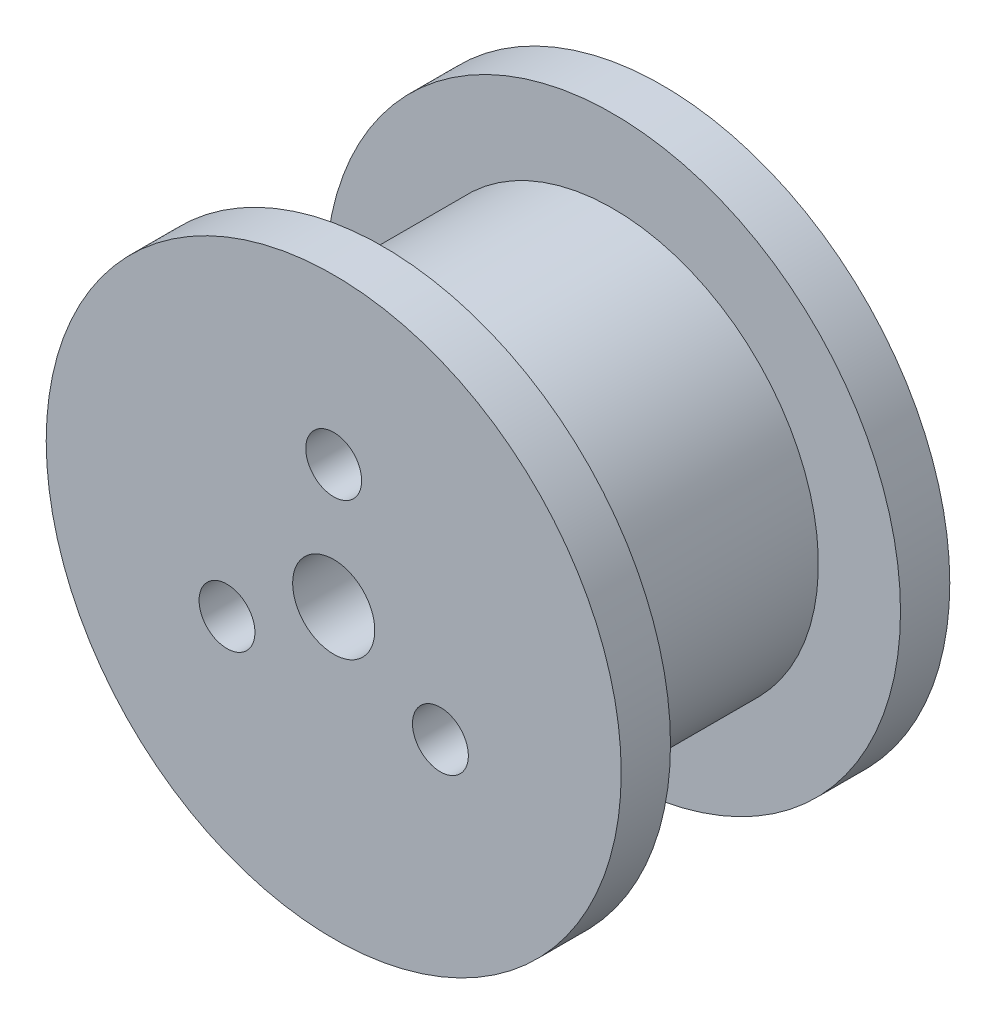
ISO-10303-21;
HEADER;
FILE_DESCRIPTION(('STEP AP214'),'2;1');
FILE_NAME('part.step','',(''),(''),'','','');
FILE_SCHEMA(('AUTOMOTIVE_DESIGN { 1 0 10303 214 1 1 1 1 }'));
ENDSEC;
DATA;
#1=APPLICATION_CONTEXT('core data for automotive mechanical design processes');
#2=APPLICATION_PROTOCOL_DEFINITION('international standard','automotive_design',2000,#1);
#3=PRODUCT_CONTEXT('',#1,'mechanical');
#4=PRODUCT('Part','Part','',(#3));
#5=PRODUCT_RELATED_PRODUCT_CATEGORY('part','',(#4));
#6=PRODUCT_DEFINITION_FORMATION('','',#4);
#7=PRODUCT_DEFINITION_CONTEXT('part definition',#1,'design');
#8=PRODUCT_DEFINITION('design','',#6,#7);
#9=PRODUCT_DEFINITION_SHAPE('','',#8);
#10=(LENGTH_UNIT() NAMED_UNIT(*) SI_UNIT(.MILLI.,.METRE.));
#11=(NAMED_UNIT(*) PLANE_ANGLE_UNIT() SI_UNIT($,.RADIAN.));
#12=(NAMED_UNIT(*) SI_UNIT($,.STERADIAN.) SOLID_ANGLE_UNIT());
#13=UNCERTAINTY_MEASURE_WITH_UNIT(LENGTH_MEASURE(1.E-05),#10,'distance_accuracy_value','');
#14=(GEOMETRIC_REPRESENTATION_CONTEXT(3) GLOBAL_UNCERTAINTY_ASSIGNED_CONTEXT((#13)) GLOBAL_UNIT_ASSIGNED_CONTEXT((#10,
#11,#12)) REPRESENTATION_CONTEXT('',''));
#15=CARTESIAN_POINT('',(0.,0.,0.));
#16=DIRECTION('',(0.,0.,1.));
#17=DIRECTION('',(1.,0.,0.));
#18=AXIS2_PLACEMENT_3D('',#15,#16,#17);
#19=CARTESIAN_POINT('',(0.,0.,20.));
#20=DIRECTION('',(0.,0.,1.));
#21=DIRECTION('',(1.,0.,0.));
#22=AXIS2_PLACEMENT_3D('',#19,#20,#21);
#23=PLANE('',#22);
#24=CARTESIAN_POINT('',(0.,0.,20.));
#25=DIRECTION('',(0.,0.,1.));
#26=DIRECTION('',(1.,0.,0.));
#27=AXIS2_PLACEMENT_3D('',#24,#25,#26);
#28=CIRCLE('',#27,17.5);
#29=CARTESIAN_POINT('',(17.5,0.,20.));
#30=VERTEX_POINT('',#29);
#31=EDGE_CURVE('E10',#30,#30,#28,.T.);
#32=ORIENTED_EDGE('',*,*,#31,.T.);
#33=EDGE_LOOP('',(#32));
#34=FACE_BOUND('',#33,.T.);
#35=CARTESIAN_POINT('',(0.,0.,20.));
#36=DIRECTION('',(0.,0.,-1.));
#37=DIRECTION('',(-1.,0.,0.));
#38=AXIS2_PLACEMENT_3D('',#35,#36,#37);
#39=CIRCLE('',#38,2.5);
#40=CARTESIAN_POINT('',(-2.5,0.,20.));
#41=VERTEX_POINT('',#40);
#42=EDGE_CURVE('E54',#41,#41,#39,.T.);
#43=ORIENTED_EDGE('',*,*,#42,.T.);
#44=EDGE_LOOP('',(#43));
#45=FACE_BOUND('',#44,.T.);
#46=CARTESIAN_POINT('',(6.49519052838281,-3.75000000000027,20.));
#47=DIRECTION('',(0.,0.,-1.));
#48=DIRECTION('',(-1.,0.,0.));
#49=AXIS2_PLACEMENT_3D('',#46,#47,#48);
#50=CIRCLE('',#49,1.7);
#51=CARTESIAN_POINT('',(4.79519052838282,-3.75000000000027,20.));
#52=VERTEX_POINT('',#51);
#53=EDGE_CURVE('E58',#52,#52,#50,.T.);
#54=ORIENTED_EDGE('',*,*,#53,.T.);
#55=EDGE_LOOP('',(#54));
#56=FACE_BOUND('',#55,.T.);
#57=CARTESIAN_POINT('',(-6.49519052838377,-3.74999999999972,20.));
#58=DIRECTION('',(0.,0.,-1.));
#59=DIRECTION('',(-1.,0.,0.));
#60=AXIS2_PLACEMENT_3D('',#57,#58,#59);
#61=CIRCLE('',#60,1.69999999999999);
#62=CARTESIAN_POINT('',(-8.19519052838376,-3.74999999999972,20.));
#63=VERTEX_POINT('',#62);
#64=EDGE_CURVE('E66',#63,#63,#61,.T.);
#65=ORIENTED_EDGE('',*,*,#64,.T.);
#66=EDGE_LOOP('',(#65));
#67=FACE_BOUND('',#66,.T.);
#68=CARTESIAN_POINT('',(0.,7.5,20.));
#69=DIRECTION('',(0.,0.,-1.));
#70=DIRECTION('',(-1.,0.,0.));
#71=AXIS2_PLACEMENT_3D('',#68,#69,#70);
#72=CIRCLE('',#71,1.7);
#73=CARTESIAN_POINT('',(-1.7,7.5,20.));
#74=VERTEX_POINT('',#73);
#75=EDGE_CURVE('E72',#74,#74,#72,.T.);
#76=ORIENTED_EDGE('',*,*,#75,.T.);
#77=EDGE_LOOP('',(#76));
#78=FACE_BOUND('',#77,.T.);
#79=ADVANCED_FACE('F30',(#34,#45,#56,#67,#78),#23,.T.);
#80=CARTESIAN_POINT('',(0.,0.,20.));
#81=DIRECTION('',(0.,0.,-1.));
#82=DIRECTION('',(-1.,0.,0.));
#83=AXIS2_PLACEMENT_3D('',#80,#81,#82);
#84=CYLINDRICAL_SURFACE('',#83,17.5);
#85=CARTESIAN_POINT('',(0.,0.,3.));
#86=DIRECTION('',(0.,0.,-1.));
#87=DIRECTION('',(-1.,0.,0.));
#88=AXIS2_PLACEMENT_3D('',#85,#86,#87);
#89=CIRCLE('',#88,17.5);
#90=CARTESIAN_POINT('',(-17.5,0.,3.));
#91=VERTEX_POINT('',#90);
#92=EDGE_CURVE('E41',#91,#91,#89,.T.);
#93=ORIENTED_EDGE('',*,*,#92,.T.);
#94=EDGE_LOOP('',(#93));
#95=FACE_BOUND('',#94,.T.);
#96=CARTESIAN_POINT('',(0.,0.,0.));
#97=DIRECTION('',(0.,0.,1.));
#98=DIRECTION('',(1.,0.,0.));
#99=AXIS2_PLACEMENT_3D('',#96,#97,#98);
#100=CIRCLE('',#99,17.5);
#101=CARTESIAN_POINT('',(17.5,0.,0.));
#102=VERTEX_POINT('',#101);
#103=EDGE_CURVE('E34',#102,#102,#100,.T.);
#104=ORIENTED_EDGE('',*,*,#103,.T.);
#105=EDGE_LOOP('',(#104));
#106=FACE_BOUND('',#105,.T.);
#107=ADVANCED_FACE('F85',(#95,#106),#84,.T.);
#108=CARTESIAN_POINT('',(0.,0.,0.));
#109=DIRECTION('',(0.,0.,1.));
#110=DIRECTION('',(1.,0.,0.));
#111=AXIS2_PLACEMENT_3D('',#108,#109,#110);
#112=PLANE('',#111);
#113=CARTESIAN_POINT('',(0.,7.5,0.));
#114=DIRECTION('',(0.,0.,-1.));
#115=DIRECTION('',(-1.,0.,0.));
#116=AXIS2_PLACEMENT_3D('',#113,#114,#115);
#117=CIRCLE('',#116,1.69999999999999);
#118=CARTESIAN_POINT('',(-1.69999999999999,7.5,0.));
#119=VERTEX_POINT('',#118);
#120=EDGE_CURVE('E75',#119,#119,#117,.T.);
#121=ORIENTED_EDGE('',*,*,#120,.F.);
#122=EDGE_LOOP('',(#121));
#123=FACE_BOUND('',#122,.T.);
#124=CARTESIAN_POINT('',(-6.49519052838377,-3.74999999999972,0.));
#125=DIRECTION('',(0.,0.,-1.));
#126=DIRECTION('',(-1.,0.,0.));
#127=AXIS2_PLACEMENT_3D('',#124,#125,#126);
#128=CIRCLE('',#127,1.69999999999999);
#129=CARTESIAN_POINT('',(-8.19519052838376,-3.74999999999972,0.));
#130=VERTEX_POINT('',#129);
#131=EDGE_CURVE('E69',#130,#130,#128,.T.);
#132=ORIENTED_EDGE('',*,*,#131,.F.);
#133=EDGE_LOOP('',(#132));
#134=FACE_BOUND('',#133,.T.);
#135=CARTESIAN_POINT('',(6.49519052838281,-3.75000000000027,0.));
#136=DIRECTION('',(0.,0.,-1.));
#137=DIRECTION('',(-1.,0.,0.));
#138=AXIS2_PLACEMENT_3D('',#135,#136,#137);
#139=CIRCLE('',#138,1.69999999999999);
#140=CARTESIAN_POINT('',(4.79519052838283,-3.75000000000027,0.));
#141=VERTEX_POINT('',#140);
#142=EDGE_CURVE('E63',#141,#141,#139,.T.);
#143=ORIENTED_EDGE('',*,*,#142,.F.);
#144=EDGE_LOOP('',(#143));
#145=FACE_BOUND('',#144,.T.);
#146=CARTESIAN_POINT('',(0.,0.,0.));
#147=DIRECTION('',(0.,0.,-1.));
#148=DIRECTION('',(-1.,0.,0.));
#149=AXIS2_PLACEMENT_3D('',#146,#147,#148);
#150=CIRCLE('',#149,2.5);
#151=CARTESIAN_POINT('',(-2.5,0.,0.));
#152=VERTEX_POINT('',#151);
#153=EDGE_CURVE('E55',#152,#152,#150,.T.);
#154=ORIENTED_EDGE('',*,*,#153,.F.);
#155=EDGE_LOOP('',(#154));
#156=FACE_BOUND('',#155,.T.);
#157=ORIENTED_EDGE('',*,*,#103,.F.);
#158=EDGE_LOOP('',(#157));
#159=FACE_BOUND('',#158,.T.);
#160=ADVANCED_FACE('F81',(#123,#134,#145,#156,#159),#112,.F.);
#161=CARTESIAN_POINT('',(0.,17.5,3.));
#162=DIRECTION('',(0.,0.,-1.));
#163=DIRECTION('',(-1.,0.,0.));
#164=AXIS2_PLACEMENT_3D('',#161,#162,#163);
#165=PLANE('',#164);
#166=ORIENTED_EDGE('',*,*,#92,.F.);
#167=EDGE_LOOP('',(#166));
#168=FACE_BOUND('',#167,.T.);
#169=CARTESIAN_POINT('',(0.,0.,3.));
#170=DIRECTION('',(0.,0.,-1.));
#171=DIRECTION('',(-1.,0.,0.));
#172=AXIS2_PLACEMENT_3D('',#169,#170,#171);
#173=CIRCLE('',#172,12.5);
#174=CARTESIAN_POINT('',(-12.5,0.,3.));
#175=VERTEX_POINT('',#174);
#176=EDGE_CURVE('E45',#175,#175,#173,.T.);
#177=ORIENTED_EDGE('',*,*,#176,.T.);
#178=EDGE_LOOP('',(#177));
#179=FACE_BOUND('',#178,.T.);
#180=ADVANCED_FACE('F84',(#168,#179),#165,.F.);
#181=CARTESIAN_POINT('',(0.,0.,0.));
#182=DIRECTION('',(0.,0.,-1.));
#183=DIRECTION('',(-1.,0.,0.));
#184=AXIS2_PLACEMENT_3D('',#181,#182,#183);
#185=CYLINDRICAL_SURFACE('',#184,12.5);
#186=ORIENTED_EDGE('',*,*,#176,.F.);
#187=EDGE_LOOP('',(#186));
#188=FACE_BOUND('',#187,.T.);
#189=CARTESIAN_POINT('',(0.,0.,17.));
#190=DIRECTION('',(0.,0.,-1.));
#191=DIRECTION('',(-1.,0.,0.));
#192=AXIS2_PLACEMENT_3D('',#189,#190,#191);
#193=CIRCLE('',#192,12.5);
#194=CARTESIAN_POINT('',(-12.5,0.,17.));
#195=VERTEX_POINT('',#194);
#196=EDGE_CURVE('E48',#195,#195,#193,.T.);
#197=ORIENTED_EDGE('',*,*,#196,.T.);
#198=EDGE_LOOP('',(#197));
#199=FACE_BOUND('',#198,.T.);
#200=ADVANCED_FACE('F111',(#188,#199),#185,.T.);
#201=CARTESIAN_POINT('',(0.,12.5,17.));
#202=DIRECTION('',(0.,0.,1.));
#203=DIRECTION('',(1.,0.,0.));
#204=AXIS2_PLACEMENT_3D('',#201,#202,#203);
#205=PLANE('',#204);
#206=ORIENTED_EDGE('',*,*,#196,.F.);
#207=EDGE_LOOP('',(#206));
#208=FACE_BOUND('',#207,.T.);
#209=CARTESIAN_POINT('',(0.,0.,17.));
#210=DIRECTION('',(0.,0.,-1.));
#211=DIRECTION('',(-1.,0.,0.));
#212=AXIS2_PLACEMENT_3D('',#209,#210,#211);
#213=CIRCLE('',#212,17.5);
#214=CARTESIAN_POINT('',(-17.5,0.,17.));
#215=VERTEX_POINT('',#214);
#216=EDGE_CURVE('E51',#215,#215,#213,.T.);
#217=ORIENTED_EDGE('',*,*,#216,.T.);
#218=EDGE_LOOP('',(#217));
#219=FACE_BOUND('',#218,.T.);
#220=ADVANCED_FACE('F102',(#208,#219),#205,.F.);
#221=ORIENTED_EDGE('',*,*,#216,.F.);
#222=EDGE_LOOP('',(#221));
#223=FACE_BOUND('',#222,.T.);
#224=ORIENTED_EDGE('',*,*,#31,.F.);
#225=EDGE_LOOP('',(#224));
#226=FACE_BOUND('',#225,.T.);
#227=ADVANCED_FACE('F32',(#223,#226),#84,.T.);
#228=CARTESIAN_POINT('',(0.,0.,20.));
#229=DIRECTION('',(0.,0.,-1.));
#230=DIRECTION('',(-1.,0.,0.));
#231=AXIS2_PLACEMENT_3D('',#228,#229,#230);
#232=CYLINDRICAL_SURFACE('',#231,2.5);
#233=ORIENTED_EDGE('',*,*,#42,.F.);
#234=EDGE_LOOP('',(#233));
#235=FACE_BOUND('',#234,.T.);
#236=ORIENTED_EDGE('',*,*,#153,.T.);
#237=EDGE_LOOP('',(#236));
#238=FACE_BOUND('',#237,.T.);
#239=ADVANCED_FACE('F101',(#235,#238),#232,.F.);
#240=CARTESIAN_POINT('',(6.49519052838281,-3.75000000000027,0.));
#241=DIRECTION('',(0.,0.,-1.));
#242=DIRECTION('',(-1.,0.,0.));
#243=AXIS2_PLACEMENT_3D('',#240,#241,#242);
#244=CYLINDRICAL_SURFACE('',#243,1.69999999999999);
#245=ORIENTED_EDGE('',*,*,#53,.F.);
#246=EDGE_LOOP('',(#245));
#247=FACE_BOUND('',#246,.T.);
#248=ORIENTED_EDGE('',*,*,#142,.T.);
#249=EDGE_LOOP('',(#248));
#250=FACE_BOUND('',#249,.T.);
#251=ADVANCED_FACE('F108',(#247,#250),#244,.F.);
#252=CARTESIAN_POINT('',(-6.49519052838377,-3.74999999999972,0.));
#253=DIRECTION('',(0.,0.,-1.));
#254=DIRECTION('',(-1.,0.,0.));
#255=AXIS2_PLACEMENT_3D('',#252,#253,#254);
#256=CYLINDRICAL_SURFACE('',#255,1.69999999999999);
#257=ORIENTED_EDGE('',*,*,#64,.F.);
#258=EDGE_LOOP('',(#257));
#259=FACE_BOUND('',#258,.T.);
#260=ORIENTED_EDGE('',*,*,#131,.T.);
#261=EDGE_LOOP('',(#260));
#262=FACE_BOUND('',#261,.T.);
#263=ADVANCED_FACE('F173',(#259,#262),#256,.F.);
#264=CARTESIAN_POINT('',(0.,7.5,0.));
#265=DIRECTION('',(0.,0.,-1.));
#266=DIRECTION('',(-1.,0.,0.));
#267=AXIS2_PLACEMENT_3D('',#264,#265,#266);
#268=CYLINDRICAL_SURFACE('',#267,1.69999999999999);
#269=ORIENTED_EDGE('',*,*,#75,.F.);
#270=EDGE_LOOP('',(#269));
#271=FACE_BOUND('',#270,.T.);
#272=ORIENTED_EDGE('',*,*,#120,.T.);
#273=EDGE_LOOP('',(#272));
#274=FACE_BOUND('',#273,.T.);
#275=ADVANCED_FACE('F79',(#271,#274),#268,.F.);
#276=CLOSED_SHELL('',(#79,#107,#160,#180,#200,#220,#227,#239,#251,#263,#275));
#277=MANIFOLD_SOLID_BREP('B2',#276);
#278=ADVANCED_BREP_SHAPE_REPRESENTATION('',(#18,#277),#14);
#279=SHAPE_DEFINITION_REPRESENTATION(#9,#278);
ENDSEC;
END-ISO-10303-21;
